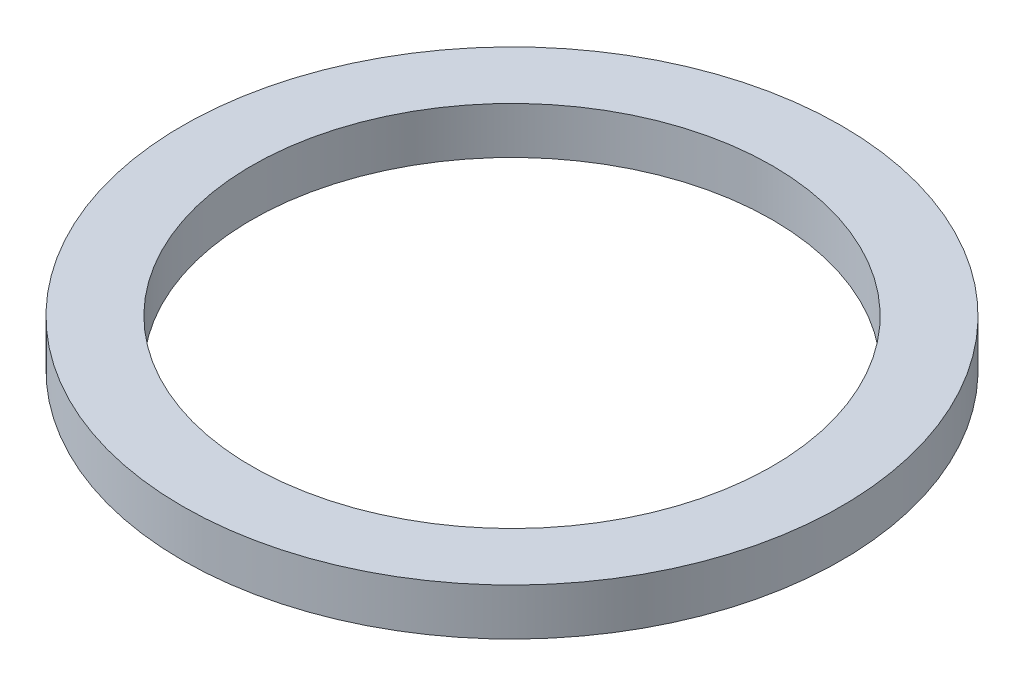
ISO-10303-21;
HEADER;
FILE_DESCRIPTION(('STEP AP214'),'2;1');
FILE_NAME('part.step','',(''),(''),'','','');
FILE_SCHEMA(('AUTOMOTIVE_DESIGN { 1 0 10303 214 1 1 1 1 }'));
ENDSEC;
DATA;
#1=APPLICATION_CONTEXT('core data for automotive mechanical design processes');
#2=APPLICATION_PROTOCOL_DEFINITION('international standard','automotive_design',2000,#1);
#3=PRODUCT_CONTEXT('',#1,'mechanical');
#4=PRODUCT('Part','Part','',(#3));
#5=PRODUCT_RELATED_PRODUCT_CATEGORY('part','',(#4));
#6=PRODUCT_DEFINITION_FORMATION('','',#4);
#7=PRODUCT_DEFINITION_CONTEXT('part definition',#1,'design');
#8=PRODUCT_DEFINITION('design','',#6,#7);
#9=PRODUCT_DEFINITION_SHAPE('','',#8);
#10=(LENGTH_UNIT() NAMED_UNIT(*) SI_UNIT(.MILLI.,.METRE.));
#11=(NAMED_UNIT(*) PLANE_ANGLE_UNIT() SI_UNIT($,.RADIAN.));
#12=(NAMED_UNIT(*) SI_UNIT($,.STERADIAN.) SOLID_ANGLE_UNIT());
#13=UNCERTAINTY_MEASURE_WITH_UNIT(LENGTH_MEASURE(1.E-05),#10,'distance_accuracy_value','');
#14=(GEOMETRIC_REPRESENTATION_CONTEXT(3) GLOBAL_UNCERTAINTY_ASSIGNED_CONTEXT((#13)) GLOBAL_UNIT_ASSIGNED_CONTEXT((#10,
#11,#12)) REPRESENTATION_CONTEXT('',''));
#15=CARTESIAN_POINT('',(0.,0.,0.));
#16=DIRECTION('',(0.,0.,1.));
#17=DIRECTION('',(1.,0.,0.));
#18=AXIS2_PLACEMENT_3D('',#15,#16,#17);
#19=CARTESIAN_POINT('',(0.,0.,0.));
#20=DIRECTION('',(0.,-1.,0.));
#21=DIRECTION('',(0.,0.,-1.));
#22=AXIS2_PLACEMENT_3D('',#19,#20,#21);
#23=CYLINDRICAL_SURFACE('',#22,6.675);
#24=CARTESIAN_POINT('',(0.,0.,0.));
#25=DIRECTION('',(0.,-1.,0.));
#26=DIRECTION('',(0.,0.,-1.));
#27=AXIS2_PLACEMENT_3D('',#24,#25,#26);
#28=CIRCLE('',#27,6.675);
#29=CARTESIAN_POINT('',(0.,0.,-6.675));
#30=VERTEX_POINT('',#29);
#31=EDGE_CURVE('E10',#30,#30,#28,.T.);
#32=ORIENTED_EDGE('',*,*,#31,.T.);
#33=EDGE_LOOP('',(#32));
#34=FACE_BOUND('',#33,.T.);
#35=CARTESIAN_POINT('',(0.,1.2,0.));
#36=DIRECTION('',(0.,-1.,0.));
#37=DIRECTION('',(0.,0.,-1.));
#38=AXIS2_PLACEMENT_3D('',#35,#36,#37);
#39=CIRCLE('',#38,6.675);
#40=CARTESIAN_POINT('',(0.,1.2,-6.675));
#41=VERTEX_POINT('',#40);
#42=EDGE_CURVE('E53',#41,#41,#39,.T.);
#43=ORIENTED_EDGE('',*,*,#42,.F.);
#44=EDGE_LOOP('',(#43));
#45=FACE_BOUND('',#44,.T.);
#46=ADVANCED_FACE('F39',(#34,#45),#23,.F.);
#47=CARTESIAN_POINT('',(0.,0.,-6.675));
#48=DIRECTION('',(0.,-1.,0.));
#49=DIRECTION('',(0.,0.,-1.));
#50=AXIS2_PLACEMENT_3D('',#47,#48,#49);
#51=PLANE('',#50);
#52=CARTESIAN_POINT('',(0.,0.,0.));
#53=DIRECTION('',(0.,-1.,0.));
#54=DIRECTION('',(0.,0.,-1.));
#55=AXIS2_PLACEMENT_3D('',#52,#53,#54);
#56=CIRCLE('',#55,8.45);
#57=CARTESIAN_POINT('',(0.,0.,-8.45));
#58=VERTEX_POINT('',#57);
#59=EDGE_CURVE('E45',#58,#58,#56,.T.);
#60=ORIENTED_EDGE('',*,*,#59,.T.);
#61=EDGE_LOOP('',(#60));
#62=FACE_BOUND('',#61,.T.);
#63=ORIENTED_EDGE('',*,*,#31,.F.);
#64=EDGE_LOOP('',(#63));
#65=FACE_BOUND('',#64,.T.);
#66=ADVANCED_FACE('F63',(#62,#65),#51,.T.);
#67=CARTESIAN_POINT('',(0.,0.,0.));
#68=DIRECTION('',(0.,-1.,0.));
#69=DIRECTION('',(0.,0.,-1.));
#70=AXIS2_PLACEMENT_3D('',#67,#68,#69);
#71=CYLINDRICAL_SURFACE('',#70,8.45);
#72=CARTESIAN_POINT('',(0.,1.2,0.));
#73=DIRECTION('',(0.,-1.,0.));
#74=DIRECTION('',(0.,0.,-1.));
#75=AXIS2_PLACEMENT_3D('',#72,#73,#74);
#76=CIRCLE('',#75,8.45);
#77=CARTESIAN_POINT('',(0.,1.2,-8.45));
#78=VERTEX_POINT('',#77);
#79=EDGE_CURVE('E49',#78,#78,#76,.T.);
#80=ORIENTED_EDGE('',*,*,#79,.T.);
#81=EDGE_LOOP('',(#80));
#82=FACE_BOUND('',#81,.T.);
#83=ORIENTED_EDGE('',*,*,#59,.F.);
#84=EDGE_LOOP('',(#83));
#85=FACE_BOUND('',#84,.T.);
#86=ADVANCED_FACE('F67',(#82,#85),#71,.T.);
#87=CARTESIAN_POINT('',(0.,1.2,-6.675));
#88=DIRECTION('',(0.,1.,0.));
#89=DIRECTION('',(0.,0.,1.));
#90=AXIS2_PLACEMENT_3D('',#87,#88,#89);
#91=PLANE('',#90);
#92=ORIENTED_EDGE('',*,*,#42,.T.);
#93=EDGE_LOOP('',(#92));
#94=FACE_BOUND('',#93,.T.);
#95=ORIENTED_EDGE('',*,*,#79,.F.);
#96=EDGE_LOOP('',(#95));
#97=FACE_BOUND('',#96,.T.);
#98=ADVANCED_FACE('F59',(#94,#97),#91,.T.);
#99=CLOSED_SHELL('',(#46,#66,#86,#98));
#100=MANIFOLD_SOLID_BREP('B2',#99);
#101=ADVANCED_BREP_SHAPE_REPRESENTATION('',(#18,#100),#14);
#102=SHAPE_DEFINITION_REPRESENTATION(#9,#101);
ENDSEC;
END-ISO-10303-21;
